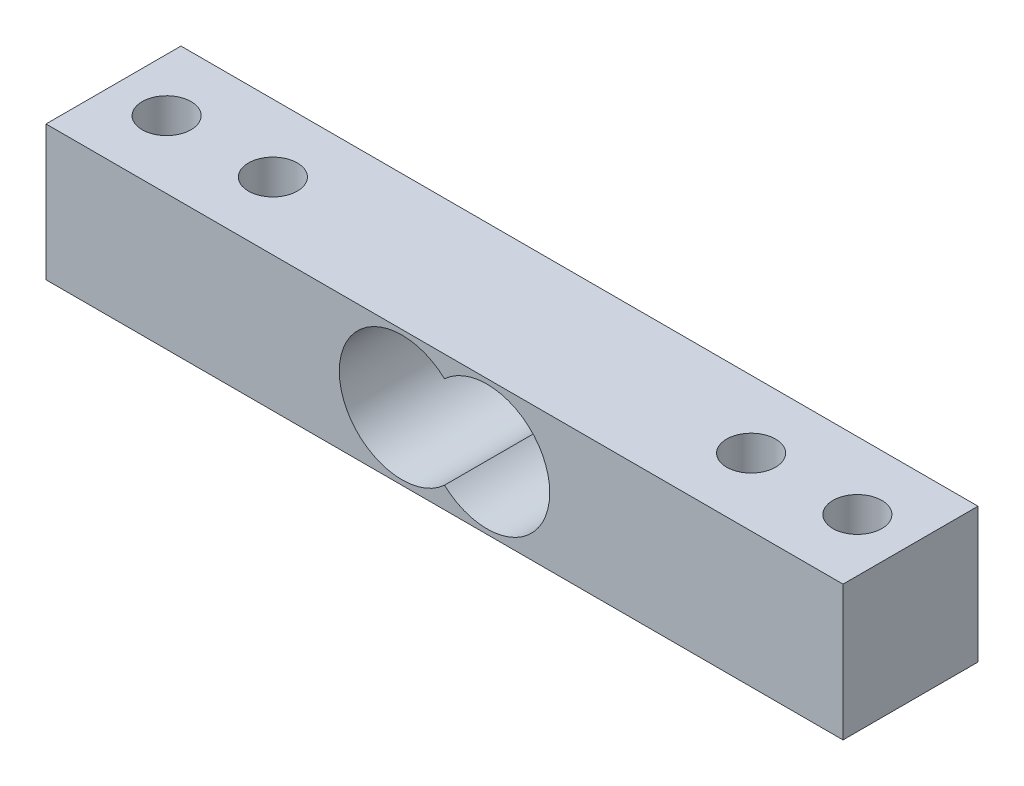
ISO-10303-21;
HEADER;
FILE_DESCRIPTION(('STEP AP214'),'2;1');
FILE_NAME('part.step','',(''),(''),'','','');
FILE_SCHEMA(('AUTOMOTIVE_DESIGN { 1 0 10303 214 1 1 1 1 }'));
ENDSEC;
DATA;
#1=APPLICATION_CONTEXT('core data for automotive mechanical design processes');
#2=APPLICATION_PROTOCOL_DEFINITION('international standard','automotive_design',2000,#1);
#3=PRODUCT_CONTEXT('',#1,'mechanical');
#4=PRODUCT('Part','Part','',(#3));
#5=PRODUCT_RELATED_PRODUCT_CATEGORY('part','',(#4));
#6=PRODUCT_DEFINITION_FORMATION('','',#4);
#7=PRODUCT_DEFINITION_CONTEXT('part definition',#1,'design');
#8=PRODUCT_DEFINITION('design','',#6,#7);
#9=PRODUCT_DEFINITION_SHAPE('','',#8);
#10=(LENGTH_UNIT() NAMED_UNIT(*) SI_UNIT(.MILLI.,.METRE.));
#11=(NAMED_UNIT(*) PLANE_ANGLE_UNIT() SI_UNIT($,.RADIAN.));
#12=(NAMED_UNIT(*) SI_UNIT($,.STERADIAN.) SOLID_ANGLE_UNIT());
#13=UNCERTAINTY_MEASURE_WITH_UNIT(LENGTH_MEASURE(1.E-05),#10,'distance_accuracy_value','');
#14=(GEOMETRIC_REPRESENTATION_CONTEXT(3) GLOBAL_UNCERTAINTY_ASSIGNED_CONTEXT((#13)) GLOBAL_UNIT_ASSIGNED_CONTEXT((#10,
#11,#12)) REPRESENTATION_CONTEXT('',''));
#15=CARTESIAN_POINT('',(0.,0.,0.));
#16=DIRECTION('',(0.,0.,1.));
#17=DIRECTION('',(1.,0.,0.));
#18=AXIS2_PLACEMENT_3D('',#15,#16,#17);
#19=CARTESIAN_POINT('',(0.,0.,6.35));
#20=DIRECTION('',(0.,0.,1.));
#21=DIRECTION('',(1.,0.,0.));
#22=AXIS2_PLACEMENT_3D('',#19,#20,#21);
#23=PLANE('',#22);
#24=DIRECTION('',(0.,1.,0.));
#25=VECTOR('',#24,1.);
#26=CARTESIAN_POINT('',(37.5,6.35,6.35));
#27=LINE('',#26,#25);
#28=CARTESIAN_POINT('',(37.5,-6.35,6.35));
#29=VERTEX_POINT('',#28);
#30=CARTESIAN_POINT('',(37.5,6.35,6.35));
#31=VERTEX_POINT('',#30);
#32=EDGE_CURVE('E112',#29,#31,#27,.T.);
#33=ORIENTED_EDGE('',*,*,#32,.T.);
#34=DIRECTION('',(-1.,0.,0.));
#35=VECTOR('',#34,1.);
#36=CARTESIAN_POINT('',(-37.5,6.35,6.35));
#37=LINE('',#36,#35);
#38=CARTESIAN_POINT('',(-37.5,6.35,6.35));
#39=VERTEX_POINT('',#38);
#40=EDGE_CURVE('E115',#31,#39,#37,.T.);
#41=ORIENTED_EDGE('',*,*,#40,.T.);
#42=DIRECTION('',(0.,-1.,0.));
#43=VECTOR('',#42,1.);
#44=CARTESIAN_POINT('',(-37.5,6.35,6.35));
#45=LINE('',#44,#43);
#46=CARTESIAN_POINT('',(-37.5,-6.35,6.35));
#47=VERTEX_POINT('',#46);
#48=EDGE_CURVE('E118',#39,#47,#45,.T.);
#49=ORIENTED_EDGE('',*,*,#48,.T.);
#50=DIRECTION('',(1.,0.,0.));
#51=VECTOR('',#50,1.);
#52=CARTESIAN_POINT('',(-37.5,-6.35,6.35));
#53=LINE('',#52,#51);
#54=EDGE_CURVE('E120',#47,#29,#53,.T.);
#55=ORIENTED_EDGE('',*,*,#54,.T.);
#56=EDGE_LOOP('',(#33,#41,#49,#55));
#57=FACE_BOUND('',#56,.T.);
#58=CARTESIAN_POINT('',(-4.,0.,6.35));
#59=DIRECTION('',(0.,0.,1.));
#60=DIRECTION('',(1.,0.,0.));
#61=AXIS2_PLACEMENT_3D('',#58,#59,#60);
#62=CIRCLE('',#61,5.9);
#63=CARTESIAN_POINT('',(0.,4.33704968844029,6.35));
#64=VERTEX_POINT('',#63);
#65=CARTESIAN_POINT('',(0.,-4.33704968844029,6.35));
#66=VERTEX_POINT('',#65);
#67=EDGE_CURVE('E91',#64,#66,#62,.T.);
#68=ORIENTED_EDGE('',*,*,#67,.F.);
#69=CARTESIAN_POINT('',(4.,0.,6.35));
#70=DIRECTION('',(0.,0.,1.));
#71=DIRECTION('',(1.,0.,0.));
#72=AXIS2_PLACEMENT_3D('',#69,#70,#71);
#73=CIRCLE('',#72,5.9);
#74=EDGE_CURVE('E97',#66,#64,#73,.T.);
#75=ORIENTED_EDGE('',*,*,#74,.F.);
#76=EDGE_LOOP('',(#68,#75));
#77=FACE_BOUND('',#76,.T.);
#78=ADVANCED_FACE('F39',(#57,#77),#23,.T.);
#79=CARTESIAN_POINT('',(0.,0.,-6.35));
#80=DIRECTION('',(0.,0.,1.));
#81=DIRECTION('',(1.,0.,0.));
#82=AXIS2_PLACEMENT_3D('',#79,#80,#81);
#83=PLANE('',#82);
#84=DIRECTION('',(0.,1.,0.));
#85=VECTOR('',#84,1.);
#86=CARTESIAN_POINT('',(37.5,6.35,-6.35));
#87=LINE('',#86,#85);
#88=CARTESIAN_POINT('',(37.5,-6.35,-6.35));
#89=VERTEX_POINT('',#88);
#90=CARTESIAN_POINT('',(37.5,6.35,-6.35));
#91=VERTEX_POINT('',#90);
#92=EDGE_CURVE('E111',#89,#91,#87,.T.);
#93=ORIENTED_EDGE('',*,*,#92,.F.);
#94=DIRECTION('',(1.,0.,0.));
#95=VECTOR('',#94,1.);
#96=CARTESIAN_POINT('',(-37.5,-6.35,-6.35));
#97=LINE('',#96,#95);
#98=CARTESIAN_POINT('',(-37.5,-6.35,-6.35));
#99=VERTEX_POINT('',#98);
#100=EDGE_CURVE('E116',#99,#89,#97,.T.);
#101=ORIENTED_EDGE('',*,*,#100,.F.);
#102=DIRECTION('',(0.,-1.,0.));
#103=VECTOR('',#102,1.);
#104=CARTESIAN_POINT('',(-37.5,6.35,-6.35));
#105=LINE('',#104,#103);
#106=CARTESIAN_POINT('',(-37.5,6.35,-6.35));
#107=VERTEX_POINT('',#106);
#108=EDGE_CURVE('E127',#107,#99,#105,.T.);
#109=ORIENTED_EDGE('',*,*,#108,.F.);
#110=DIRECTION('',(-1.,0.,0.));
#111=VECTOR('',#110,1.);
#112=CARTESIAN_POINT('',(-37.5,6.35,-6.35));
#113=LINE('',#112,#111);
#114=EDGE_CURVE('E125',#91,#107,#113,.T.);
#115=ORIENTED_EDGE('',*,*,#114,.F.);
#116=EDGE_LOOP('',(#93,#101,#109,#115));
#117=FACE_BOUND('',#116,.T.);
#118=CARTESIAN_POINT('',(4.,0.,-6.35));
#119=DIRECTION('',(0.,0.,1.));
#120=DIRECTION('',(1.,0.,0.));
#121=AXIS2_PLACEMENT_3D('',#118,#119,#120);
#122=CIRCLE('',#121,5.9);
#123=CARTESIAN_POINT('',(0.,-4.33704968844029,-6.35));
#124=VERTEX_POINT('',#123);
#125=CARTESIAN_POINT('',(0.,4.33704968844029,-6.35));
#126=VERTEX_POINT('',#125);
#127=EDGE_CURVE('E61',#124,#126,#122,.T.);
#128=ORIENTED_EDGE('',*,*,#127,.T.);
#129=CARTESIAN_POINT('',(-4.,0.,-6.35));
#130=DIRECTION('',(0.,0.,1.));
#131=DIRECTION('',(1.,0.,0.));
#132=AXIS2_PLACEMENT_3D('',#129,#130,#131);
#133=CIRCLE('',#132,5.9);
#134=EDGE_CURVE('E101',#126,#124,#133,.T.);
#135=ORIENTED_EDGE('',*,*,#134,.T.);
#136=EDGE_LOOP('',(#128,#135));
#137=FACE_BOUND('',#136,.T.);
#138=ADVANCED_FACE('F145',(#117,#137),#83,.F.);
#139=CARTESIAN_POINT('',(37.5,6.35,6.35));
#140=DIRECTION('',(-1.,0.,0.));
#141=DIRECTION('',(0.,0.,1.));
#142=AXIS2_PLACEMENT_3D('',#139,#140,#141);
#143=PLANE('',#142);
#144=ORIENTED_EDGE('',*,*,#92,.T.);
#145=DIRECTION('',(0.,0.,-1.));
#146=VECTOR('',#145,1.);
#147=CARTESIAN_POINT('',(37.5,6.35,6.35));
#148=LINE('',#147,#146);
#149=EDGE_CURVE('E11',#31,#91,#148,.T.);
#150=ORIENTED_EDGE('',*,*,#149,.F.);
#151=ORIENTED_EDGE('',*,*,#32,.F.);
#152=DIRECTION('',(0.,0.,-1.));
#153=VECTOR('',#152,1.);
#154=CARTESIAN_POINT('',(37.5,-6.35,6.35));
#155=LINE('',#154,#153);
#156=EDGE_CURVE('E122',#29,#89,#155,.T.);
#157=ORIENTED_EDGE('',*,*,#156,.T.);
#158=EDGE_LOOP('',(#144,#150,#151,#157));
#159=FACE_BOUND('',#158,.T.);
#160=ADVANCED_FACE('F41',(#159),#143,.F.);
#161=CARTESIAN_POINT('',(-37.5,6.35,6.35));
#162=DIRECTION('',(0.,-1.,0.));
#163=DIRECTION('',(0.,0.,-1.));
#164=AXIS2_PLACEMENT_3D('',#161,#162,#163);
#165=PLANE('',#164);
#166=CARTESIAN_POINT('',(32.5,6.35,0.));
#167=DIRECTION('',(0.,1.,0.));
#168=DIRECTION('',(0.,0.,1.));
#169=AXIS2_PLACEMENT_3D('',#166,#167,#168);
#170=CIRCLE('',#169,2.3);
#171=CARTESIAN_POINT('',(32.5,6.35,2.3));
#172=VERTEX_POINT('',#171);
#173=EDGE_CURVE('E199',#172,#172,#170,.T.);
#174=ORIENTED_EDGE('',*,*,#173,.F.);
#175=EDGE_LOOP('',(#174));
#176=FACE_BOUND('',#175,.T.);
#177=CARTESIAN_POINT('',(-22.5,6.35,0.));
#178=DIRECTION('',(0.,1.,0.));
#179=DIRECTION('',(0.,0.,-1.));
#180=AXIS2_PLACEMENT_3D('',#177,#178,#179);
#181=CIRCLE('',#180,2.3);
#182=CARTESIAN_POINT('',(-22.5,6.35,-2.3));
#183=VERTEX_POINT('',#182);
#184=EDGE_CURVE('E204',#183,#183,#181,.T.);
#185=ORIENTED_EDGE('',*,*,#184,.F.);
#186=EDGE_LOOP('',(#185));
#187=FACE_BOUND('',#186,.T.);
#188=CARTESIAN_POINT('',(-32.5,6.35,0.));
#189=DIRECTION('',(0.,1.,0.));
#190=DIRECTION('',(0.,0.,-1.));
#191=AXIS2_PLACEMENT_3D('',#188,#189,#190);
#192=CIRCLE('',#191,2.3);
#193=CARTESIAN_POINT('',(-32.5,6.35,-2.3));
#194=VERTEX_POINT('',#193);
#195=EDGE_CURVE('E196',#194,#194,#192,.T.);
#196=ORIENTED_EDGE('',*,*,#195,.F.);
#197=EDGE_LOOP('',(#196));
#198=FACE_BOUND('',#197,.T.);
#199=CARTESIAN_POINT('',(22.5,6.35,0.));
#200=DIRECTION('',(0.,1.,0.));
#201=DIRECTION('',(0.,0.,1.));
#202=AXIS2_PLACEMENT_3D('',#199,#200,#201);
#203=CIRCLE('',#202,2.3);
#204=CARTESIAN_POINT('',(22.5,6.35,2.3));
#205=VERTEX_POINT('',#204);
#206=EDGE_CURVE('E195',#205,#205,#203,.T.);
#207=ORIENTED_EDGE('',*,*,#206,.F.);
#208=EDGE_LOOP('',(#207));
#209=FACE_BOUND('',#208,.T.);
#210=ORIENTED_EDGE('',*,*,#114,.T.);
#211=DIRECTION('',(0.,0.,-1.));
#212=VECTOR('',#211,1.);
#213=CARTESIAN_POINT('',(-37.5,6.35,6.35));
#214=LINE('',#213,#212);
#215=EDGE_CURVE('E47',#39,#107,#214,.T.);
#216=ORIENTED_EDGE('',*,*,#215,.F.);
#217=ORIENTED_EDGE('',*,*,#40,.F.);
#218=ORIENTED_EDGE('',*,*,#149,.T.);
#219=EDGE_LOOP('',(#210,#216,#217,#218));
#220=FACE_BOUND('',#219,.T.);
#221=ADVANCED_FACE('F155',(#176,#187,#198,#209,#220),#165,.F.);
#222=CARTESIAN_POINT('',(-37.5,6.35,6.35));
#223=DIRECTION('',(1.,0.,0.));
#224=DIRECTION('',(0.,0.,-1.));
#225=AXIS2_PLACEMENT_3D('',#222,#223,#224);
#226=PLANE('',#225);
#227=ORIENTED_EDGE('',*,*,#108,.T.);
#228=DIRECTION('',(0.,0.,-1.));
#229=VECTOR('',#228,1.);
#230=CARTESIAN_POINT('',(-37.5,-6.35,6.35));
#231=LINE('',#230,#229);
#232=EDGE_CURVE('E132',#47,#99,#231,.T.);
#233=ORIENTED_EDGE('',*,*,#232,.F.);
#234=ORIENTED_EDGE('',*,*,#48,.F.);
#235=ORIENTED_EDGE('',*,*,#215,.T.);
#236=EDGE_LOOP('',(#227,#233,#234,#235));
#237=FACE_BOUND('',#236,.T.);
#238=ADVANCED_FACE('F139',(#237),#226,.F.);
#239=CARTESIAN_POINT('',(-37.5,-6.35,6.35));
#240=DIRECTION('',(0.,1.,0.));
#241=DIRECTION('',(0.,0.,1.));
#242=AXIS2_PLACEMENT_3D('',#239,#240,#241);
#243=PLANE('',#242);
#244=CARTESIAN_POINT('',(32.5,-6.35,0.));
#245=DIRECTION('',(0.,1.,0.));
#246=DIRECTION('',(0.,0.,1.));
#247=AXIS2_PLACEMENT_3D('',#244,#245,#246);
#248=CIRCLE('',#247,2.3);
#249=CARTESIAN_POINT('',(32.5,-6.35,2.3));
#250=VERTEX_POINT('',#249);
#251=EDGE_CURVE('E108',#250,#250,#248,.T.);
#252=ORIENTED_EDGE('',*,*,#251,.T.);
#253=EDGE_LOOP('',(#252));
#254=FACE_BOUND('',#253,.T.);
#255=CARTESIAN_POINT('',(-22.5,-6.35,0.));
#256=DIRECTION('',(0.,1.,0.));
#257=DIRECTION('',(0.,0.,-1.));
#258=AXIS2_PLACEMENT_3D('',#255,#256,#257);
#259=CIRCLE('',#258,2.3);
#260=CARTESIAN_POINT('',(-22.5,-6.35,-2.3));
#261=VERTEX_POINT('',#260);
#262=EDGE_CURVE('E187',#261,#261,#259,.T.);
#263=ORIENTED_EDGE('',*,*,#262,.T.);
#264=EDGE_LOOP('',(#263));
#265=FACE_BOUND('',#264,.T.);
#266=CARTESIAN_POINT('',(-32.5,-6.35,0.));
#267=DIRECTION('',(0.,1.,0.));
#268=DIRECTION('',(0.,0.,-1.));
#269=AXIS2_PLACEMENT_3D('',#266,#267,#268);
#270=CIRCLE('',#269,2.3);
#271=CARTESIAN_POINT('',(-32.5,-6.35,-2.3));
#272=VERTEX_POINT('',#271);
#273=EDGE_CURVE('E105',#272,#272,#270,.T.);
#274=ORIENTED_EDGE('',*,*,#273,.T.);
#275=EDGE_LOOP('',(#274));
#276=FACE_BOUND('',#275,.T.);
#277=CARTESIAN_POINT('',(22.5,-6.35,0.));
#278=DIRECTION('',(0.,1.,0.));
#279=DIRECTION('',(0.,0.,1.));
#280=AXIS2_PLACEMENT_3D('',#277,#278,#279);
#281=CIRCLE('',#280,2.3);
#282=CARTESIAN_POINT('',(22.5,-6.35,2.3));
#283=VERTEX_POINT('',#282);
#284=EDGE_CURVE('E193',#283,#283,#281,.T.);
#285=ORIENTED_EDGE('',*,*,#284,.T.);
#286=EDGE_LOOP('',(#285));
#287=FACE_BOUND('',#286,.T.);
#288=ORIENTED_EDGE('',*,*,#100,.T.);
#289=ORIENTED_EDGE('',*,*,#156,.F.);
#290=ORIENTED_EDGE('',*,*,#54,.F.);
#291=ORIENTED_EDGE('',*,*,#232,.T.);
#292=EDGE_LOOP('',(#288,#289,#290,#291));
#293=FACE_BOUND('',#292,.T.);
#294=ADVANCED_FACE('F149',(#254,#265,#276,#287,#293),#243,.F.);
#295=CARTESIAN_POINT('',(4.,0.,6.35));
#296=DIRECTION('',(0.,0.,-1.));
#297=DIRECTION('',(-1.,0.,0.));
#298=AXIS2_PLACEMENT_3D('',#295,#296,#297);
#299=CYLINDRICAL_SURFACE('',#298,5.9);
#300=ORIENTED_EDGE('',*,*,#127,.F.);
#301=DIRECTION('',(0.,0.,-1.));
#302=VECTOR('',#301,1.);
#303=CARTESIAN_POINT('',(0.,-4.33704968844029,6.35));
#304=LINE('',#303,#302);
#305=EDGE_CURVE('E93',#66,#124,#304,.T.);
#306=ORIENTED_EDGE('',*,*,#305,.F.);
#307=ORIENTED_EDGE('',*,*,#74,.T.);
#308=DIRECTION('',(0.,0.,-1.));
#309=VECTOR('',#308,1.);
#310=CARTESIAN_POINT('',(0.,4.33704968844029,6.35));
#311=LINE('',#310,#309);
#312=EDGE_CURVE('E54',#64,#126,#311,.T.);
#313=ORIENTED_EDGE('',*,*,#312,.T.);
#314=EDGE_LOOP('',(#300,#306,#307,#313));
#315=FACE_BOUND('',#314,.T.);
#316=ADVANCED_FACE('F99',(#315),#299,.F.);
#317=CARTESIAN_POINT('',(-4.,0.,6.35));
#318=DIRECTION('',(0.,0.,-1.));
#319=DIRECTION('',(-1.,0.,0.));
#320=AXIS2_PLACEMENT_3D('',#317,#318,#319);
#321=CYLINDRICAL_SURFACE('',#320,5.9);
#322=ORIENTED_EDGE('',*,*,#134,.F.);
#323=ORIENTED_EDGE('',*,*,#312,.F.);
#324=ORIENTED_EDGE('',*,*,#67,.T.);
#325=ORIENTED_EDGE('',*,*,#305,.T.);
#326=EDGE_LOOP('',(#322,#323,#324,#325));
#327=FACE_BOUND('',#326,.T.);
#328=ADVANCED_FACE('F92',(#327),#321,.F.);
#329=CARTESIAN_POINT('',(22.5,-6.35,0.));
#330=DIRECTION('',(0.,1.,0.));
#331=DIRECTION('',(0.,0.,1.));
#332=AXIS2_PLACEMENT_3D('',#329,#330,#331);
#333=CYLINDRICAL_SURFACE('',#332,2.3);
#334=ORIENTED_EDGE('',*,*,#284,.F.);
#335=EDGE_LOOP('',(#334));
#336=FACE_BOUND('',#335,.T.);
#337=ORIENTED_EDGE('',*,*,#206,.T.);
#338=EDGE_LOOP('',(#337));
#339=FACE_BOUND('',#338,.T.);
#340=ADVANCED_FACE('F222',(#336,#339),#333,.F.);
#341=CARTESIAN_POINT('',(-32.5,-6.35,0.));
#342=DIRECTION('',(0.,1.,0.));
#343=DIRECTION('',(0.,0.,1.));
#344=AXIS2_PLACEMENT_3D('',#341,#342,#343);
#345=CYLINDRICAL_SURFACE('',#344,2.3);
#346=ORIENTED_EDGE('',*,*,#273,.F.);
#347=EDGE_LOOP('',(#346));
#348=FACE_BOUND('',#347,.T.);
#349=ORIENTED_EDGE('',*,*,#195,.T.);
#350=EDGE_LOOP('',(#349));
#351=FACE_BOUND('',#350,.T.);
#352=ADVANCED_FACE('F218',(#348,#351),#345,.F.);
#353=CARTESIAN_POINT('',(-22.5,-6.35,0.));
#354=DIRECTION('',(0.,1.,0.));
#355=DIRECTION('',(0.,0.,1.));
#356=AXIS2_PLACEMENT_3D('',#353,#354,#355);
#357=CYLINDRICAL_SURFACE('',#356,2.3);
#358=ORIENTED_EDGE('',*,*,#262,.F.);
#359=EDGE_LOOP('',(#358));
#360=FACE_BOUND('',#359,.T.);
#361=ORIENTED_EDGE('',*,*,#184,.T.);
#362=EDGE_LOOP('',(#361));
#363=FACE_BOUND('',#362,.T.);
#364=ADVANCED_FACE('F212',(#360,#363),#357,.F.);
#365=CARTESIAN_POINT('',(32.5,-6.35,0.));
#366=DIRECTION('',(0.,1.,0.));
#367=DIRECTION('',(0.,0.,1.));
#368=AXIS2_PLACEMENT_3D('',#365,#366,#367);
#369=CYLINDRICAL_SURFACE('',#368,2.3);
#370=ORIENTED_EDGE('',*,*,#251,.F.);
#371=EDGE_LOOP('',(#370));
#372=FACE_BOUND('',#371,.T.);
#373=ORIENTED_EDGE('',*,*,#173,.T.);
#374=EDGE_LOOP('',(#373));
#375=FACE_BOUND('',#374,.T.);
#376=ADVANCED_FACE('F210',(#372,#375),#369,.F.);
#377=CLOSED_SHELL('',(#78,#138,#160,#221,#238,#294,#316,#328,#340,#352,#364,#376));
#378=MANIFOLD_SOLID_BREP('B2',#377);
#379=ADVANCED_BREP_SHAPE_REPRESENTATION('',(#18,#378),#14);
#380=SHAPE_DEFINITION_REPRESENTATION(#9,#379);
ENDSEC;
END-ISO-10303-21;
